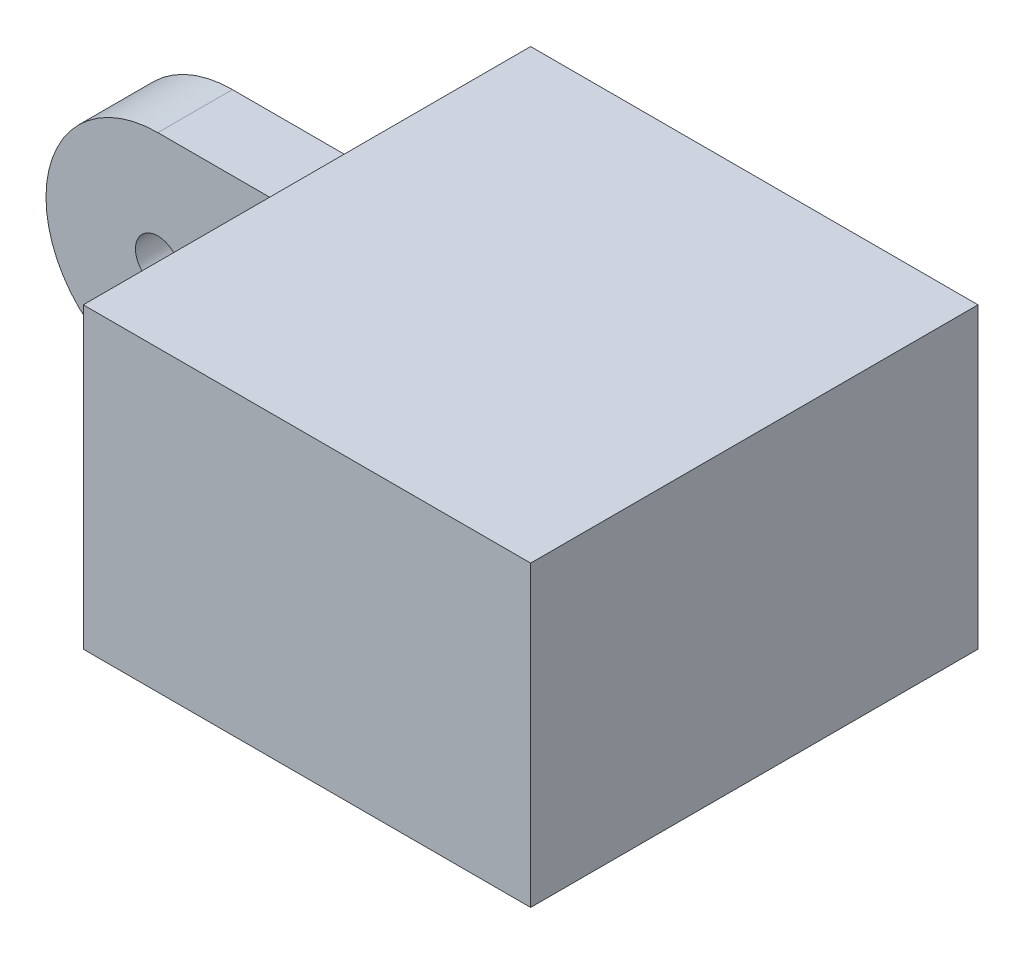
ISO-10303-21;
HEADER;
FILE_DESCRIPTION(('STEP AP214'),'2;1');
FILE_NAME('part.step','',(''),(''),'','','');
FILE_SCHEMA(('AUTOMOTIVE_DESIGN { 1 0 10303 214 1 1 1 1 }'));
ENDSEC;
DATA;
#1=APPLICATION_CONTEXT('core data for automotive mechanical design processes');
#2=APPLICATION_PROTOCOL_DEFINITION('international standard','automotive_design',2000,#1);
#3=PRODUCT_CONTEXT('',#1,'mechanical');
#4=PRODUCT('Part','Part','',(#3));
#5=PRODUCT_RELATED_PRODUCT_CATEGORY('part','',(#4));
#6=PRODUCT_DEFINITION_FORMATION('','',#4);
#7=PRODUCT_DEFINITION_CONTEXT('part definition',#1,'design');
#8=PRODUCT_DEFINITION('design','',#6,#7);
#9=PRODUCT_DEFINITION_SHAPE('','',#8);
#10=(LENGTH_UNIT() NAMED_UNIT(*) SI_UNIT(.MILLI.,.METRE.));
#11=(NAMED_UNIT(*) PLANE_ANGLE_UNIT() SI_UNIT($,.RADIAN.));
#12=(NAMED_UNIT(*) SI_UNIT($,.STERADIAN.) SOLID_ANGLE_UNIT());
#13=UNCERTAINTY_MEASURE_WITH_UNIT(LENGTH_MEASURE(1.E-05),#10,'distance_accuracy_value','');
#14=(GEOMETRIC_REPRESENTATION_CONTEXT(3) GLOBAL_UNCERTAINTY_ASSIGNED_CONTEXT((#13)) GLOBAL_UNIT_ASSIGNED_CONTEXT((#10,
#11,#12)) REPRESENTATION_CONTEXT('',''));
#15=CARTESIAN_POINT('',(0.,0.,0.));
#16=DIRECTION('',(0.,0.,1.));
#17=DIRECTION('',(1.,0.,0.));
#18=AXIS2_PLACEMENT_3D('',#15,#16,#17);
#19=CARTESIAN_POINT('',(-50.,0.,0.));
#20=DIRECTION('',(0.,0.,1.));
#21=DIRECTION('',(1.,0.,0.));
#22=AXIS2_PLACEMENT_3D('',#19,#20,#21);
#23=PLANE('',#22);
#24=CARTESIAN_POINT('',(-50.,0.,0.));
#25=DIRECTION('',(0.,0.,1.));
#26=DIRECTION('',(1.,0.,0.));
#27=AXIS2_PLACEMENT_3D('',#24,#25,#26);
#28=CIRCLE('',#27,3.);
#29=CARTESIAN_POINT('',(-47.,0.,0.));
#30=VERTEX_POINT('',#29);
#31=EDGE_CURVE('E161',#30,#30,#28,.T.);
#32=ORIENTED_EDGE('',*,*,#31,.T.);
#33=EDGE_LOOP('',(#32));
#34=FACE_BOUND('',#33,.T.);
#35=DIRECTION('',(0.,1.,0.));
#36=VECTOR('',#35,1.);
#37=CARTESIAN_POINT('',(-30.,-20.,0.));
#38=LINE('',#37,#36);
#39=CARTESIAN_POINT('',(-30.,-15.,0.));
#40=VERTEX_POINT('',#39);
#41=CARTESIAN_POINT('',(-30.,15.,0.));
#42=VERTEX_POINT('',#41);
#43=EDGE_CURVE('E11',#40,#42,#38,.T.);
#44=ORIENTED_EDGE('',*,*,#43,.F.);
#45=DIRECTION('',(1.,0.,0.));
#46=VECTOR('',#45,1.);
#47=CARTESIAN_POINT('',(-50.,-15.,0.));
#48=LINE('',#47,#46);
#49=CARTESIAN_POINT('',(-50.,-15.,0.));
#50=VERTEX_POINT('',#49);
#51=EDGE_CURVE('E175',#50,#40,#48,.T.);
#52=ORIENTED_EDGE('',*,*,#51,.F.);
#53=CARTESIAN_POINT('',(-50.,0.,0.));
#54=DIRECTION('',(0.,0.,1.));
#55=DIRECTION('',(1.,0.,0.));
#56=AXIS2_PLACEMENT_3D('',#53,#54,#55);
#57=CIRCLE('',#56,15.);
#58=CARTESIAN_POINT('',(-50.,15.,0.));
#59=VERTEX_POINT('',#58);
#60=EDGE_CURVE('E82',#59,#50,#57,.T.);
#61=ORIENTED_EDGE('',*,*,#60,.F.);
#62=DIRECTION('',(-1.,0.,0.));
#63=VECTOR('',#62,1.);
#64=CARTESIAN_POINT('',(-50.,15.,0.));
#65=LINE('',#64,#63);
#66=EDGE_CURVE('E75',#42,#59,#65,.T.);
#67=ORIENTED_EDGE('',*,*,#66,.F.);
#68=EDGE_LOOP('',(#44,#52,#61,#67));
#69=FACE_BOUND('',#68,.T.);
#70=ADVANCED_FACE('F41',(#34,#69),#23,.F.);
#71=CARTESIAN_POINT('',(-50.,0.,10.));
#72=DIRECTION('',(0.,0.,1.));
#73=DIRECTION('',(1.,0.,0.));
#74=AXIS2_PLACEMENT_3D('',#71,#72,#73);
#75=PLANE('',#74);
#76=DIRECTION('',(0.,-1.,0.));
#77=VECTOR('',#76,1.);
#78=CARTESIAN_POINT('',(-30.,20.,10.));
#79=LINE('',#78,#77);
#80=CARTESIAN_POINT('',(-30.,15.,10.));
#81=VERTEX_POINT('',#80);
#82=CARTESIAN_POINT('',(-30.,-15.,10.));
#83=VERTEX_POINT('',#82);
#84=EDGE_CURVE('E52',#81,#83,#79,.T.);
#85=ORIENTED_EDGE('',*,*,#84,.F.);
#86=DIRECTION('',(-1.,0.,0.));
#87=VECTOR('',#86,1.);
#88=CARTESIAN_POINT('',(-50.,15.,10.));
#89=LINE('',#88,#87);
#90=CARTESIAN_POINT('',(-50.,15.,10.));
#91=VERTEX_POINT('',#90);
#92=EDGE_CURVE('E171',#81,#91,#89,.T.);
#93=ORIENTED_EDGE('',*,*,#92,.T.);
#94=CARTESIAN_POINT('',(-50.,0.,10.));
#95=DIRECTION('',(0.,0.,1.));
#96=DIRECTION('',(1.,0.,0.));
#97=AXIS2_PLACEMENT_3D('',#94,#95,#96);
#98=CIRCLE('',#97,15.);
#99=CARTESIAN_POINT('',(-50.,-15.,10.));
#100=VERTEX_POINT('',#99);
#101=EDGE_CURVE('E174',#91,#100,#98,.T.);
#102=ORIENTED_EDGE('',*,*,#101,.T.);
#103=DIRECTION('',(1.,0.,0.));
#104=VECTOR('',#103,1.);
#105=CARTESIAN_POINT('',(-50.,-15.,10.));
#106=LINE('',#105,#104);
#107=EDGE_CURVE('E61',#100,#83,#106,.T.);
#108=ORIENTED_EDGE('',*,*,#107,.T.);
#109=EDGE_LOOP('',(#85,#93,#102,#108));
#110=FACE_BOUND('',#109,.T.);
#111=CARTESIAN_POINT('',(-50.,0.,10.));
#112=DIRECTION('',(0.,0.,1.));
#113=DIRECTION('',(1.,0.,0.));
#114=AXIS2_PLACEMENT_3D('',#111,#112,#113);
#115=CIRCLE('',#114,3.);
#116=CARTESIAN_POINT('',(-47.,0.,10.));
#117=VERTEX_POINT('',#116);
#118=EDGE_CURVE('E164',#117,#117,#115,.T.);
#119=ORIENTED_EDGE('',*,*,#118,.F.);
#120=EDGE_LOOP('',(#119));
#121=FACE_BOUND('',#120,.T.);
#122=ADVANCED_FACE('F227',(#110,#121),#75,.T.);
#123=CARTESIAN_POINT('',(30.,20.,10.));
#124=DIRECTION('',(-1.,0.,0.));
#125=DIRECTION('',(0.,-1.,0.));
#126=AXIS2_PLACEMENT_3D('',#123,#124,#125);
#127=PLANE('',#126);
#128=DIRECTION('',(0.,0.,-1.));
#129=VECTOR('',#128,1.);
#130=CARTESIAN_POINT('',(30.,-20.,10.));
#131=LINE('',#130,#129);
#132=CARTESIAN_POINT('',(30.,-20.,40.));
#133=VERTEX_POINT('',#132);
#134=CARTESIAN_POINT('',(30.,-20.,-20.));
#135=VERTEX_POINT('',#134);
#136=EDGE_CURVE('E130',#133,#135,#131,.T.);
#137=ORIENTED_EDGE('',*,*,#136,.T.);
#138=DIRECTION('',(0.,-1.,0.));
#139=VECTOR('',#138,1.);
#140=CARTESIAN_POINT('',(30.,20.,-20.));
#141=LINE('',#140,#139);
#142=CARTESIAN_POINT('',(30.,20.,-20.));
#143=VERTEX_POINT('',#142);
#144=EDGE_CURVE('E129',#143,#135,#141,.T.);
#145=ORIENTED_EDGE('',*,*,#144,.F.);
#146=DIRECTION('',(0.,0.,-1.));
#147=VECTOR('',#146,1.);
#148=CARTESIAN_POINT('',(30.,20.,10.));
#149=LINE('',#148,#147);
#150=CARTESIAN_POINT('',(30.,20.,40.));
#151=VERTEX_POINT('',#150);
#152=EDGE_CURVE('E45',#151,#143,#149,.T.);
#153=ORIENTED_EDGE('',*,*,#152,.F.);
#154=DIRECTION('',(0.,1.,0.));
#155=VECTOR('',#154,1.);
#156=CARTESIAN_POINT('',(30.,-20.,40.));
#157=LINE('',#156,#155);
#158=EDGE_CURVE('E158',#133,#151,#157,.T.);
#159=ORIENTED_EDGE('',*,*,#158,.F.);
#160=EDGE_LOOP('',(#137,#145,#153,#159));
#161=FACE_BOUND('',#160,.T.);
#162=ADVANCED_FACE('F43',(#161),#127,.F.);
#163=CARTESIAN_POINT('',(-30.,20.,10.));
#164=DIRECTION('',(0.,-1.,0.));
#165=DIRECTION('',(0.,0.,-1.));
#166=AXIS2_PLACEMENT_3D('',#163,#164,#165);
#167=PLANE('',#166);
#168=ORIENTED_EDGE('',*,*,#152,.T.);
#169=DIRECTION('',(1.,0.,0.));
#170=VECTOR('',#169,1.);
#171=CARTESIAN_POINT('',(-30.,20.,-20.));
#172=LINE('',#171,#170);
#173=CARTESIAN_POINT('',(-30.,20.,-20.));
#174=VERTEX_POINT('',#173);
#175=EDGE_CURVE('E120',#174,#143,#172,.T.);
#176=ORIENTED_EDGE('',*,*,#175,.F.);
#177=DIRECTION('',(0.,0.,-1.));
#178=VECTOR('',#177,1.);
#179=CARTESIAN_POINT('',(-30.,20.,10.));
#180=LINE('',#179,#178);
#181=CARTESIAN_POINT('',(-30.,20.,40.));
#182=VERTEX_POINT('',#181);
#183=EDGE_CURVE('E127',#182,#174,#180,.T.);
#184=ORIENTED_EDGE('',*,*,#183,.F.);
#185=DIRECTION('',(-1.,0.,0.));
#186=VECTOR('',#185,1.);
#187=CARTESIAN_POINT('',(30.,20.,40.));
#188=LINE('',#187,#186);
#189=EDGE_CURVE('E122',#151,#182,#188,.T.);
#190=ORIENTED_EDGE('',*,*,#189,.F.);
#191=EDGE_LOOP('',(#168,#176,#184,#190));
#192=FACE_BOUND('',#191,.T.);
#193=ADVANCED_FACE('F118',(#192),#167,.F.);
#194=CARTESIAN_POINT('',(-50.,15.,10.));
#195=DIRECTION('',(0.,-1.,0.));
#196=DIRECTION('',(0.,0.,-1.));
#197=AXIS2_PLACEMENT_3D('',#194,#195,#196);
#198=PLANE('',#197);
#199=ORIENTED_EDGE('',*,*,#66,.T.);
#200=DIRECTION('',(0.,0.,-1.));
#201=VECTOR('',#200,1.);
#202=CARTESIAN_POINT('',(-50.,15.,10.));
#203=LINE('',#202,#201);
#204=EDGE_CURVE('E199',#91,#59,#203,.T.);
#205=ORIENTED_EDGE('',*,*,#204,.F.);
#206=ORIENTED_EDGE('',*,*,#92,.F.);
#207=DIRECTION('',(0.,0.,-1.));
#208=VECTOR('',#207,1.);
#209=CARTESIAN_POINT('',(-30.,15.,10.));
#210=LINE('',#209,#208);
#211=EDGE_CURVE('E202',#81,#42,#210,.T.);
#212=ORIENTED_EDGE('',*,*,#211,.T.);
#213=EDGE_LOOP('',(#199,#205,#206,#212));
#214=FACE_BOUND('',#213,.T.);
#215=ADVANCED_FACE('F275',(#214),#198,.F.);
#216=CARTESIAN_POINT('',(-50.,0.,10.));
#217=DIRECTION('',(0.,0.,-1.));
#218=DIRECTION('',(-1.,0.,0.));
#219=AXIS2_PLACEMENT_3D('',#216,#217,#218);
#220=CYLINDRICAL_SURFACE('',#219,15.);
#221=ORIENTED_EDGE('',*,*,#60,.T.);
#222=DIRECTION('',(0.,0.,-1.));
#223=VECTOR('',#222,1.);
#224=CARTESIAN_POINT('',(-50.,-15.,10.));
#225=LINE('',#224,#223);
#226=EDGE_CURVE('E196',#100,#50,#225,.T.);
#227=ORIENTED_EDGE('',*,*,#226,.F.);
#228=ORIENTED_EDGE('',*,*,#101,.F.);
#229=ORIENTED_EDGE('',*,*,#204,.T.);
#230=EDGE_LOOP('',(#221,#227,#228,#229));
#231=FACE_BOUND('',#230,.T.);
#232=ADVANCED_FACE('F256',(#231),#220,.T.);
#233=CARTESIAN_POINT('',(-50.,-15.,10.));
#234=DIRECTION('',(0.,1.,0.));
#235=DIRECTION('',(-1.,0.,0.));
#236=AXIS2_PLACEMENT_3D('',#233,#234,#235);
#237=PLANE('',#236);
#238=ORIENTED_EDGE('',*,*,#51,.T.);
#239=DIRECTION('',(0.,0.,-1.));
#240=VECTOR('',#239,1.);
#241=CARTESIAN_POINT('',(-30.,-15.,10.));
#242=LINE('',#241,#240);
#243=EDGE_CURVE('E192',#83,#40,#242,.T.);
#244=ORIENTED_EDGE('',*,*,#243,.F.);
#245=ORIENTED_EDGE('',*,*,#107,.F.);
#246=ORIENTED_EDGE('',*,*,#226,.T.);
#247=EDGE_LOOP('',(#238,#244,#245,#246));
#248=FACE_BOUND('',#247,.T.);
#249=ADVANCED_FACE('F223',(#248),#237,.F.);
#250=CARTESIAN_POINT('',(-30.,-15.,10.));
#251=DIRECTION('',(1.,0.,0.));
#252=DIRECTION('',(0.,0.,-1.));
#253=AXIS2_PLACEMENT_3D('',#250,#251,#252);
#254=PLANE('',#253);
#255=DIRECTION('',(0.,1.,0.));
#256=VECTOR('',#255,1.);
#257=CARTESIAN_POINT('',(-30.,-20.,-20.));
#258=LINE('',#257,#256);
#259=CARTESIAN_POINT('',(-30.,-20.,-20.));
#260=VERTEX_POINT('',#259);
#261=EDGE_CURVE('E140',#260,#174,#258,.T.);
#262=ORIENTED_EDGE('',*,*,#261,.F.);
#263=DIRECTION('',(0.,0.,-1.));
#264=VECTOR('',#263,1.);
#265=CARTESIAN_POINT('',(-30.,-20.,10.));
#266=LINE('',#265,#264);
#267=CARTESIAN_POINT('',(-30.,-20.,40.));
#268=VERTEX_POINT('',#267);
#269=EDGE_CURVE('E189',#268,#260,#266,.T.);
#270=ORIENTED_EDGE('',*,*,#269,.F.);
#271=DIRECTION('',(0.,-1.,0.));
#272=VECTOR('',#271,1.);
#273=CARTESIAN_POINT('',(-30.,20.,40.));
#274=LINE('',#273,#272);
#275=EDGE_CURVE('E150',#182,#268,#274,.T.);
#276=ORIENTED_EDGE('',*,*,#275,.F.);
#277=ORIENTED_EDGE('',*,*,#183,.T.);
#278=EDGE_LOOP('',(#262,#270,#276,#277));
#279=FACE_BOUND('',#278,.T.);
#280=ORIENTED_EDGE('',*,*,#243,.T.);
#281=ORIENTED_EDGE('',*,*,#43,.T.);
#282=ORIENTED_EDGE('',*,*,#211,.F.);
#283=ORIENTED_EDGE('',*,*,#84,.T.);
#284=EDGE_LOOP('',(#280,#281,#282,#283));
#285=FACE_BOUND('',#284,.T.);
#286=ADVANCED_FACE('F207',(#279,#285),#254,.F.);
#287=CARTESIAN_POINT('',(-30.,-20.,10.));
#288=DIRECTION('',(0.,1.,0.));
#289=DIRECTION('',(0.,0.,1.));
#290=AXIS2_PLACEMENT_3D('',#287,#288,#289);
#291=PLANE('',#290);
#292=ORIENTED_EDGE('',*,*,#269,.T.);
#293=DIRECTION('',(-1.,0.,0.));
#294=VECTOR('',#293,1.);
#295=CARTESIAN_POINT('',(30.,-20.,-20.));
#296=LINE('',#295,#294);
#297=EDGE_CURVE('E135',#135,#260,#296,.T.);
#298=ORIENTED_EDGE('',*,*,#297,.F.);
#299=ORIENTED_EDGE('',*,*,#136,.F.);
#300=DIRECTION('',(1.,0.,0.));
#301=VECTOR('',#300,1.);
#302=CARTESIAN_POINT('',(-30.,-20.,40.));
#303=LINE('',#302,#301);
#304=EDGE_CURVE('E154',#268,#133,#303,.T.);
#305=ORIENTED_EDGE('',*,*,#304,.F.);
#306=EDGE_LOOP('',(#292,#298,#299,#305));
#307=FACE_BOUND('',#306,.T.);
#308=ADVANCED_FACE('F213',(#307),#291,.F.);
#309=CARTESIAN_POINT('',(-50.,0.,10.));
#310=DIRECTION('',(0.,0.,-1.));
#311=DIRECTION('',(-1.,0.,0.));
#312=AXIS2_PLACEMENT_3D('',#309,#310,#311);
#313=CYLINDRICAL_SURFACE('',#312,3.);
#314=ORIENTED_EDGE('',*,*,#118,.T.);
#315=EDGE_LOOP('',(#314));
#316=FACE_BOUND('',#315,.T.);
#317=ORIENTED_EDGE('',*,*,#31,.F.);
#318=EDGE_LOOP('',(#317));
#319=FACE_BOUND('',#318,.T.);
#320=ADVANCED_FACE('F215',(#316,#319),#313,.F.);
#321=CARTESIAN_POINT('',(0.,0.,40.));
#322=DIRECTION('',(0.,0.,1.));
#323=DIRECTION('',(1.,0.,0.));
#324=AXIS2_PLACEMENT_3D('',#321,#322,#323);
#325=PLANE('',#324);
#326=ORIENTED_EDGE('',*,*,#189,.T.);
#327=ORIENTED_EDGE('',*,*,#275,.T.);
#328=ORIENTED_EDGE('',*,*,#304,.T.);
#329=ORIENTED_EDGE('',*,*,#158,.T.);
#330=EDGE_LOOP('',(#326,#327,#328,#329));
#331=FACE_BOUND('',#330,.T.);
#332=ADVANCED_FACE('F211',(#331),#325,.T.);
#333=CARTESIAN_POINT('',(0.,0.,-20.));
#334=DIRECTION('',(0.,0.,-1.));
#335=DIRECTION('',(-1.,0.,0.));
#336=AXIS2_PLACEMENT_3D('',#333,#334,#335);
#337=PLANE('',#336);
#338=ORIENTED_EDGE('',*,*,#175,.T.);
#339=ORIENTED_EDGE('',*,*,#144,.T.);
#340=ORIENTED_EDGE('',*,*,#297,.T.);
#341=ORIENTED_EDGE('',*,*,#261,.T.);
#342=EDGE_LOOP('',(#338,#339,#340,#341));
#343=FACE_BOUND('',#342,.T.);
#344=ADVANCED_FACE('F138',(#343),#337,.T.);
#345=CLOSED_SHELL('',(#70,#122,#162,#193,#215,#232,#249,#286,#308,#320,#332,#344));
#346=MANIFOLD_SOLID_BREP('B2',#345);
#347=ADVANCED_BREP_SHAPE_REPRESENTATION('',(#18,#346),#14);
#348=SHAPE_DEFINITION_REPRESENTATION(#9,#347);
ENDSEC;
END-ISO-10303-21;
